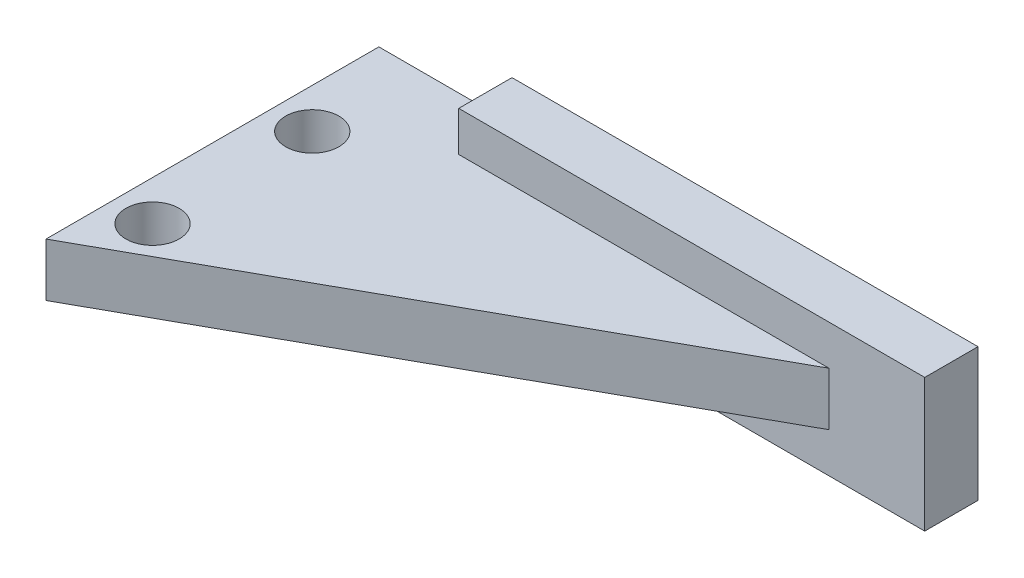
ISO-10303-21;
HEADER;
FILE_DESCRIPTION(('STEP AP214'),'2;1');
FILE_NAME('part.step','',(''),(''),'','','');
FILE_SCHEMA(('AUTOMOTIVE_DESIGN { 1 0 10303 214 1 1 1 1 }'));
ENDSEC;
DATA;
#1=APPLICATION_CONTEXT('core data for automotive mechanical design processes');
#2=APPLICATION_PROTOCOL_DEFINITION('international standard','automotive_design',2000,#1);
#3=PRODUCT_CONTEXT('',#1,'mechanical');
#4=PRODUCT('Part','Part','',(#3));
#5=PRODUCT_RELATED_PRODUCT_CATEGORY('part','',(#4));
#6=PRODUCT_DEFINITION_FORMATION('','',#4);
#7=PRODUCT_DEFINITION_CONTEXT('part definition',#1,'design');
#8=PRODUCT_DEFINITION('design','',#6,#7);
#9=PRODUCT_DEFINITION_SHAPE('','',#8);
#10=(LENGTH_UNIT() NAMED_UNIT(*) SI_UNIT(.MILLI.,.METRE.));
#11=(NAMED_UNIT(*) PLANE_ANGLE_UNIT() SI_UNIT($,.RADIAN.));
#12=(NAMED_UNIT(*) SI_UNIT($,.STERADIAN.) SOLID_ANGLE_UNIT());
#13=UNCERTAINTY_MEASURE_WITH_UNIT(LENGTH_MEASURE(1.E-05),#10,'distance_accuracy_value','');
#14=(GEOMETRIC_REPRESENTATION_CONTEXT(3) GLOBAL_UNCERTAINTY_ASSIGNED_CONTEXT((#13)) GLOBAL_UNIT_ASSIGNED_CONTEXT((#10,
#11,#12)) REPRESENTATION_CONTEXT('',''));
#15=CARTESIAN_POINT('',(0.,0.,0.));
#16=DIRECTION('',(0.,0.,1.));
#17=DIRECTION('',(1.,0.,0.));
#18=AXIS2_PLACEMENT_3D('',#15,#16,#17);
#19=CARTESIAN_POINT('',(0.,4.,0.));
#20=DIRECTION('',(-0.485642931178632,0.,-0.874157276121538));
#21=DIRECTION('',(-0.874157276121538,0.,0.485642931178632));
#22=AXIS2_PLACEMENT_3D('',#19,#20,#21);
#23=PLANE('',#22);
#24=DIRECTION('',(0.,-1.,0.));
#25=VECTOR('',#24,1.);
#26=CARTESIAN_POINT('',(37.8,4.,-21.));
#27=LINE('',#26,#25);
#28=CARTESIAN_POINT('',(37.8,4.,-21.));
#29=VERTEX_POINT('',#28);
#30=CARTESIAN_POINT('',(37.8,0.,-21.));
#31=VERTEX_POINT('',#30);
#32=EDGE_CURVE('E112',#29,#31,#27,.T.);
#33=ORIENTED_EDGE('',*,*,#32,.F.);
#34=DIRECTION('',(0.874157276121538,0.,-0.485642931178632));
#35=VECTOR('',#34,1.);
#36=CARTESIAN_POINT('',(0.,4.,0.));
#37=LINE('',#36,#35);
#38=CARTESIAN_POINT('',(0.,4.,0.));
#39=VERTEX_POINT('',#38);
#40=EDGE_CURVE('E114',#39,#29,#37,.T.);
#41=ORIENTED_EDGE('',*,*,#40,.F.);
#42=DIRECTION('',(0.,-1.,0.));
#43=VECTOR('',#42,1.);
#44=CARTESIAN_POINT('',(0.,4.,0.));
#45=LINE('',#44,#43);
#46=CARTESIAN_POINT('',(0.,0.,0.));
#47=VERTEX_POINT('',#46);
#48=EDGE_CURVE('E100',#39,#47,#45,.T.);
#49=ORIENTED_EDGE('',*,*,#48,.T.);
#50=DIRECTION('',(0.874157276121538,0.,-0.485642931178632));
#51=VECTOR('',#50,1.);
#52=CARTESIAN_POINT('',(0.,0.,0.));
#53=LINE('',#52,#51);
#54=EDGE_CURVE('E76',#47,#31,#53,.T.);
#55=ORIENTED_EDGE('',*,*,#54,.T.);
#56=EDGE_LOOP('',(#33,#41,#49,#55));
#57=FACE_BOUND('',#56,.T.);
#58=ADVANCED_FACE('F33',(#57),#23,.F.);
#59=CARTESIAN_POINT('',(0.,4.,-25.));
#60=DIRECTION('',(1.,0.,0.));
#61=DIRECTION('',(0.,0.,-1.));
#62=AXIS2_PLACEMENT_3D('',#59,#60,#61);
#63=PLANE('',#62);
#64=DIRECTION('',(0.,0.,1.));
#65=VECTOR('',#64,1.);
#66=CARTESIAN_POINT('',(0.,0.,-25.));
#67=LINE('',#66,#65);
#68=CARTESIAN_POINT('',(0.,0.,-25.));
#69=VERTEX_POINT('',#68);
#70=EDGE_CURVE('E81',#69,#47,#67,.T.);
#71=ORIENTED_EDGE('',*,*,#70,.T.);
#72=ORIENTED_EDGE('',*,*,#48,.F.);
#73=DIRECTION('',(0.,0.,1.));
#74=VECTOR('',#73,1.);
#75=CARTESIAN_POINT('',(0.,4.,-25.));
#76=LINE('',#75,#74);
#77=CARTESIAN_POINT('',(0.,4.,-25.));
#78=VERTEX_POINT('',#77);
#79=EDGE_CURVE('E75',#78,#39,#76,.T.);
#80=ORIENTED_EDGE('',*,*,#79,.F.);
#81=DIRECTION('',(0.,-1.,0.));
#82=VECTOR('',#81,1.);
#83=CARTESIAN_POINT('',(0.,4.,-25.));
#84=LINE('',#83,#82);
#85=EDGE_CURVE('E70',#78,#69,#84,.T.);
#86=ORIENTED_EDGE('',*,*,#85,.T.);
#87=EDGE_LOOP('',(#71,#72,#80,#86));
#88=FACE_BOUND('',#87,.T.);
#89=ADVANCED_FACE('F35',(#88),#63,.F.);
#90=CARTESIAN_POINT('',(45.,4.,-25.));
#91=DIRECTION('',(0.,0.,1.));
#92=DIRECTION('',(1.,0.,0.));
#93=AXIS2_PLACEMENT_3D('',#90,#91,#92);
#94=PLANE('',#93);
#95=DIRECTION('',(-1.,0.,0.));
#96=VECTOR('',#95,1.);
#97=CARTESIAN_POINT('',(45.,4.,-25.));
#98=LINE('',#97,#96);
#99=CARTESIAN_POINT('',(10.,4.,-25.));
#100=VERTEX_POINT('',#99);
#101=EDGE_CURVE('E56',#100,#78,#98,.T.);
#102=ORIENTED_EDGE('',*,*,#101,.F.);
#103=DIRECTION('',(0.,1.,0.));
#104=VECTOR('',#103,1.);
#105=CARTESIAN_POINT('',(10.,7.,-25.));
#106=LINE('',#105,#104);
#107=CARTESIAN_POINT('',(10.,7.,-25.));
#108=VERTEX_POINT('',#107);
#109=EDGE_CURVE('E151',#100,#108,#106,.T.);
#110=ORIENTED_EDGE('',*,*,#109,.T.);
#111=DIRECTION('',(1.,0.,0.));
#112=VECTOR('',#111,1.);
#113=CARTESIAN_POINT('',(45.,7.,-25.));
#114=LINE('',#113,#112);
#115=CARTESIAN_POINT('',(45.,7.,-25.));
#116=VERTEX_POINT('',#115);
#117=EDGE_CURVE('E146',#108,#116,#114,.T.);
#118=ORIENTED_EDGE('',*,*,#117,.T.);
#119=DIRECTION('',(0.,-1.,0.));
#120=VECTOR('',#119,1.);
#121=CARTESIAN_POINT('',(45.,4.,-25.));
#122=LINE('',#121,#120);
#123=CARTESIAN_POINT('',(45.,-3.,-25.));
#124=VERTEX_POINT('',#123);
#125=EDGE_CURVE('E82',#116,#124,#122,.T.);
#126=ORIENTED_EDGE('',*,*,#125,.T.);
#127=DIRECTION('',(-1.,0.,0.));
#128=VECTOR('',#127,1.);
#129=CARTESIAN_POINT('',(45.,-3.,-25.));
#130=LINE('',#129,#128);
#131=CARTESIAN_POINT('',(10.,-3.,-25.));
#132=VERTEX_POINT('',#131);
#133=EDGE_CURVE('E152',#124,#132,#130,.T.);
#134=ORIENTED_EDGE('',*,*,#133,.T.);
#135=CARTESIAN_POINT('',(10.,0.,-25.));
#136=VERTEX_POINT('',#135);
#137=EDGE_CURVE('E48',#132,#136,#106,.T.);
#138=ORIENTED_EDGE('',*,*,#137,.T.);
#139=DIRECTION('',(-1.,0.,0.));
#140=VECTOR('',#139,1.);
#141=CARTESIAN_POINT('',(45.,0.,-25.));
#142=LINE('',#141,#140);
#143=EDGE_CURVE('E67',#136,#69,#142,.T.);
#144=ORIENTED_EDGE('',*,*,#143,.T.);
#145=ORIENTED_EDGE('',*,*,#85,.F.);
#146=EDGE_LOOP('',(#102,#110,#118,#126,#134,#138,#144,#145));
#147=FACE_BOUND('',#146,.T.);
#148=ADVANCED_FACE('F69',(#147),#94,.F.);
#149=CARTESIAN_POINT('',(0.,4.,0.));
#150=DIRECTION('',(0.,-1.,0.));
#151=DIRECTION('',(0.,0.,-1.));
#152=AXIS2_PLACEMENT_3D('',#149,#150,#151);
#153=PLANE('',#152);
#154=CARTESIAN_POINT('',(3.,4.,-17.));
#155=DIRECTION('',(0.,1.,0.));
#156=DIRECTION('',(0.,0.,1.));
#157=AXIS2_PLACEMENT_3D('',#154,#155,#156);
#158=CIRCLE('',#157,2.);
#159=CARTESIAN_POINT('',(3.,4.,-15.));
#160=VERTEX_POINT('',#159);
#161=EDGE_CURVE('E93',#160,#160,#158,.T.);
#162=ORIENTED_EDGE('',*,*,#161,.F.);
#163=EDGE_LOOP('',(#162));
#164=FACE_BOUND('',#163,.T.);
#165=CARTESIAN_POINT('',(3.,4.,-5.00000000000001));
#166=DIRECTION('',(0.,1.,0.));
#167=DIRECTION('',(0.,0.,1.));
#168=AXIS2_PLACEMENT_3D('',#165,#166,#167);
#169=CIRCLE('',#168,2.);
#170=CARTESIAN_POINT('',(3.,4.,-3.00000000000001));
#171=VERTEX_POINT('',#170);
#172=EDGE_CURVE('E119',#171,#171,#169,.T.);
#173=ORIENTED_EDGE('',*,*,#172,.F.);
#174=EDGE_LOOP('',(#173));
#175=FACE_BOUND('',#174,.T.);
#176=DIRECTION('',(1.,0.,0.));
#177=VECTOR('',#176,1.);
#178=CARTESIAN_POINT('',(0.,4.,-21.));
#179=LINE('',#178,#177);
#180=CARTESIAN_POINT('',(10.,4.,-21.));
#181=VERTEX_POINT('',#180);
#182=EDGE_CURVE('E129',#181,#29,#179,.T.);
#183=ORIENTED_EDGE('',*,*,#182,.F.);
#184=DIRECTION('',(0.,0.,-1.));
#185=VECTOR('',#184,1.);
#186=CARTESIAN_POINT('',(10.,4.,0.));
#187=LINE('',#186,#185);
#188=EDGE_CURVE('E123',#181,#100,#187,.T.);
#189=ORIENTED_EDGE('',*,*,#188,.T.);
#190=ORIENTED_EDGE('',*,*,#101,.T.);
#191=ORIENTED_EDGE('',*,*,#79,.T.);
#192=ORIENTED_EDGE('',*,*,#40,.T.);
#193=EDGE_LOOP('',(#183,#189,#190,#191,#192));
#194=FACE_BOUND('',#193,.T.);
#195=ADVANCED_FACE('F116',(#164,#175,#194),#153,.F.);
#196=CARTESIAN_POINT('',(0.,0.,0.));
#197=DIRECTION('',(0.,-1.,0.));
#198=DIRECTION('',(0.,0.,-1.));
#199=AXIS2_PLACEMENT_3D('',#196,#197,#198);
#200=PLANE('',#199);
#201=DIRECTION('',(0.,0.,-1.));
#202=VECTOR('',#201,1.);
#203=CARTESIAN_POINT('',(10.,0.,0.));
#204=LINE('',#203,#202);
#205=CARTESIAN_POINT('',(10.,0.,-21.));
#206=VERTEX_POINT('',#205);
#207=EDGE_CURVE('E11',#206,#136,#204,.T.);
#208=ORIENTED_EDGE('',*,*,#207,.F.);
#209=DIRECTION('',(1.,0.,0.));
#210=VECTOR('',#209,1.);
#211=CARTESIAN_POINT('',(0.,0.,-21.));
#212=LINE('',#211,#210);
#213=EDGE_CURVE('E41',#206,#31,#212,.T.);
#214=ORIENTED_EDGE('',*,*,#213,.T.);
#215=ORIENTED_EDGE('',*,*,#54,.F.);
#216=ORIENTED_EDGE('',*,*,#70,.F.);
#217=ORIENTED_EDGE('',*,*,#143,.F.);
#218=EDGE_LOOP('',(#208,#214,#215,#216,#217));
#219=FACE_BOUND('',#218,.T.);
#220=CARTESIAN_POINT('',(3.,0.,-17.));
#221=DIRECTION('',(0.,1.,0.));
#222=DIRECTION('',(0.,0.,1.));
#223=AXIS2_PLACEMENT_3D('',#220,#221,#222);
#224=CIRCLE('',#223,2.);
#225=CARTESIAN_POINT('',(3.,0.,-15.));
#226=VERTEX_POINT('',#225);
#227=EDGE_CURVE('E89',#226,#226,#224,.T.);
#228=ORIENTED_EDGE('',*,*,#227,.T.);
#229=EDGE_LOOP('',(#228));
#230=FACE_BOUND('',#229,.T.);
#231=CARTESIAN_POINT('',(3.,0.,-5.00000000000001));
#232=DIRECTION('',(0.,1.,0.));
#233=DIRECTION('',(0.,0.,1.));
#234=AXIS2_PLACEMENT_3D('',#231,#232,#233);
#235=CIRCLE('',#234,2.);
#236=CARTESIAN_POINT('',(3.,0.,-3.00000000000001));
#237=VERTEX_POINT('',#236);
#238=EDGE_CURVE('E122',#237,#237,#235,.T.);
#239=ORIENTED_EDGE('',*,*,#238,.T.);
#240=EDGE_LOOP('',(#239));
#241=FACE_BOUND('',#240,.T.);
#242=ADVANCED_FACE('F84',(#219,#230,#241),#200,.T.);
#243=CARTESIAN_POINT('',(3.,0.,-5.00000000000001));
#244=DIRECTION('',(0.,1.,0.));
#245=DIRECTION('',(0.,0.,1.));
#246=AXIS2_PLACEMENT_3D('',#243,#244,#245);
#247=CYLINDRICAL_SURFACE('',#246,2.);
#248=ORIENTED_EDGE('',*,*,#238,.F.);
#249=EDGE_LOOP('',(#248));
#250=FACE_BOUND('',#249,.T.);
#251=ORIENTED_EDGE('',*,*,#172,.T.);
#252=EDGE_LOOP('',(#251));
#253=FACE_BOUND('',#252,.T.);
#254=ADVANCED_FACE('F225',(#250,#253),#247,.F.);
#255=CARTESIAN_POINT('',(3.,0.,-17.));
#256=DIRECTION('',(0.,1.,0.));
#257=DIRECTION('',(0.,0.,1.));
#258=AXIS2_PLACEMENT_3D('',#255,#256,#257);
#259=CYLINDRICAL_SURFACE('',#258,2.);
#260=ORIENTED_EDGE('',*,*,#227,.F.);
#261=EDGE_LOOP('',(#260));
#262=FACE_BOUND('',#261,.T.);
#263=ORIENTED_EDGE('',*,*,#161,.T.);
#264=EDGE_LOOP('',(#263));
#265=FACE_BOUND('',#264,.T.);
#266=ADVANCED_FACE('F231',(#262,#265),#259,.F.);
#267=CARTESIAN_POINT('',(10.,7.,-21.));
#268=DIRECTION('',(-1.,0.,0.));
#269=DIRECTION('',(0.,0.,1.));
#270=AXIS2_PLACEMENT_3D('',#267,#268,#269);
#271=PLANE('',#270);
#272=ORIENTED_EDGE('',*,*,#188,.F.);
#273=DIRECTION('',(0.,1.,0.));
#274=VECTOR('',#273,1.);
#275=CARTESIAN_POINT('',(10.,7.,-21.));
#276=LINE('',#275,#274);
#277=CARTESIAN_POINT('',(10.,7.,-21.));
#278=VERTEX_POINT('',#277);
#279=EDGE_CURVE('E158',#181,#278,#276,.T.);
#280=ORIENTED_EDGE('',*,*,#279,.T.);
#281=DIRECTION('',(0.,0.,-1.));
#282=VECTOR('',#281,1.);
#283=CARTESIAN_POINT('',(10.,7.,-21.));
#284=LINE('',#283,#282);
#285=EDGE_CURVE('E141',#278,#108,#284,.T.);
#286=ORIENTED_EDGE('',*,*,#285,.T.);
#287=ORIENTED_EDGE('',*,*,#109,.F.);
#288=EDGE_LOOP('',(#272,#280,#286,#287));
#289=FACE_BOUND('',#288,.T.);
#290=ADVANCED_FACE('F193',(#289),#271,.T.);
#291=CARTESIAN_POINT('',(0.,0.,-21.));
#292=DIRECTION('',(0.,0.,-1.));
#293=DIRECTION('',(-1.,0.,0.));
#294=AXIS2_PLACEMENT_3D('',#291,#292,#293);
#295=PLANE('',#294);
#296=ORIENTED_EDGE('',*,*,#279,.F.);
#297=ORIENTED_EDGE('',*,*,#182,.T.);
#298=ORIENTED_EDGE('',*,*,#32,.T.);
#299=ORIENTED_EDGE('',*,*,#213,.F.);
#300=CARTESIAN_POINT('',(10.,-3.,-21.));
#301=VERTEX_POINT('',#300);
#302=EDGE_CURVE('E156',#301,#206,#276,.T.);
#303=ORIENTED_EDGE('',*,*,#302,.F.);
#304=DIRECTION('',(-1.,0.,0.));
#305=VECTOR('',#304,1.);
#306=CARTESIAN_POINT('',(45.,-3.,-21.));
#307=LINE('',#306,#305);
#308=CARTESIAN_POINT('',(45.,-3.,-21.));
#309=VERTEX_POINT('',#308);
#310=EDGE_CURVE('E159',#309,#301,#307,.T.);
#311=ORIENTED_EDGE('',*,*,#310,.F.);
#312=DIRECTION('',(0.,-1.,0.));
#313=VECTOR('',#312,1.);
#314=CARTESIAN_POINT('',(45.,7.,-21.));
#315=LINE('',#314,#313);
#316=CARTESIAN_POINT('',(45.,7.,-21.));
#317=VERTEX_POINT('',#316);
#318=EDGE_CURVE('E149',#317,#309,#315,.T.);
#319=ORIENTED_EDGE('',*,*,#318,.F.);
#320=DIRECTION('',(1.,0.,0.));
#321=VECTOR('',#320,1.);
#322=CARTESIAN_POINT('',(45.,7.,-21.));
#323=LINE('',#322,#321);
#324=EDGE_CURVE('E138',#278,#317,#323,.T.);
#325=ORIENTED_EDGE('',*,*,#324,.F.);
#326=EDGE_LOOP('',(#296,#297,#298,#299,#303,#311,#319,#325));
#327=FACE_BOUND('',#326,.T.);
#328=ADVANCED_FACE('F179',(#327),#295,.F.);
#329=CARTESIAN_POINT('',(45.,7.,-21.));
#330=DIRECTION('',(1.,0.,0.));
#331=DIRECTION('',(0.,0.,-1.));
#332=AXIS2_PLACEMENT_3D('',#329,#330,#331);
#333=PLANE('',#332);
#334=ORIENTED_EDGE('',*,*,#125,.F.);
#335=DIRECTION('',(0.,0.,-1.));
#336=VECTOR('',#335,1.);
#337=CARTESIAN_POINT('',(45.,7.,-21.));
#338=LINE('',#337,#336);
#339=EDGE_CURVE('E133',#317,#116,#338,.T.);
#340=ORIENTED_EDGE('',*,*,#339,.F.);
#341=ORIENTED_EDGE('',*,*,#318,.T.);
#342=DIRECTION('',(0.,0.,-1.));
#343=VECTOR('',#342,1.);
#344=CARTESIAN_POINT('',(45.,-3.,-21.));
#345=LINE('',#344,#343);
#346=EDGE_CURVE('E134',#309,#124,#345,.T.);
#347=ORIENTED_EDGE('',*,*,#346,.T.);
#348=EDGE_LOOP('',(#334,#340,#341,#347));
#349=FACE_BOUND('',#348,.T.);
#350=ADVANCED_FACE('F168',(#349),#333,.T.);
#351=CARTESIAN_POINT('',(45.,7.,-21.));
#352=DIRECTION('',(0.,1.,0.));
#353=DIRECTION('',(0.,0.,1.));
#354=AXIS2_PLACEMENT_3D('',#351,#352,#353);
#355=PLANE('',#354);
#356=ORIENTED_EDGE('',*,*,#117,.F.);
#357=ORIENTED_EDGE('',*,*,#285,.F.);
#358=ORIENTED_EDGE('',*,*,#324,.T.);
#359=ORIENTED_EDGE('',*,*,#339,.T.);
#360=EDGE_LOOP('',(#356,#357,#358,#359));
#361=FACE_BOUND('',#360,.T.);
#362=ADVANCED_FACE('F186',(#361),#355,.T.);
#363=ORIENTED_EDGE('',*,*,#302,.T.);
#364=ORIENTED_EDGE('',*,*,#207,.T.);
#365=ORIENTED_EDGE('',*,*,#137,.F.);
#366=DIRECTION('',(0.,0.,-1.));
#367=VECTOR('',#366,1.);
#368=CARTESIAN_POINT('',(10.,-3.,-21.));
#369=LINE('',#368,#367);
#370=EDGE_CURVE('E137',#301,#132,#369,.T.);
#371=ORIENTED_EDGE('',*,*,#370,.F.);
#372=EDGE_LOOP('',(#363,#364,#365,#371));
#373=FACE_BOUND('',#372,.T.);
#374=ADVANCED_FACE('F206',(#373),#271,.T.);
#375=CARTESIAN_POINT('',(45.,-3.,-21.));
#376=DIRECTION('',(0.,-1.,0.));
#377=DIRECTION('',(0.,0.,-1.));
#378=AXIS2_PLACEMENT_3D('',#375,#376,#377);
#379=PLANE('',#378);
#380=ORIENTED_EDGE('',*,*,#133,.F.);
#381=ORIENTED_EDGE('',*,*,#346,.F.);
#382=ORIENTED_EDGE('',*,*,#310,.T.);
#383=ORIENTED_EDGE('',*,*,#370,.T.);
#384=EDGE_LOOP('',(#380,#381,#382,#383));
#385=FACE_BOUND('',#384,.T.);
#386=ADVANCED_FACE('F208',(#385),#379,.T.);
#387=CLOSED_SHELL('',(#58,#89,#148,#195,#242,#254,#266,#290,#328,#350,#362,#374,#386));
#388=MANIFOLD_SOLID_BREP('B2',#387);
#389=ADVANCED_BREP_SHAPE_REPRESENTATION('',(#18,#388),#14);
#390=SHAPE_DEFINITION_REPRESENTATION(#9,#389);
ENDSEC;
END-ISO-10303-21;
